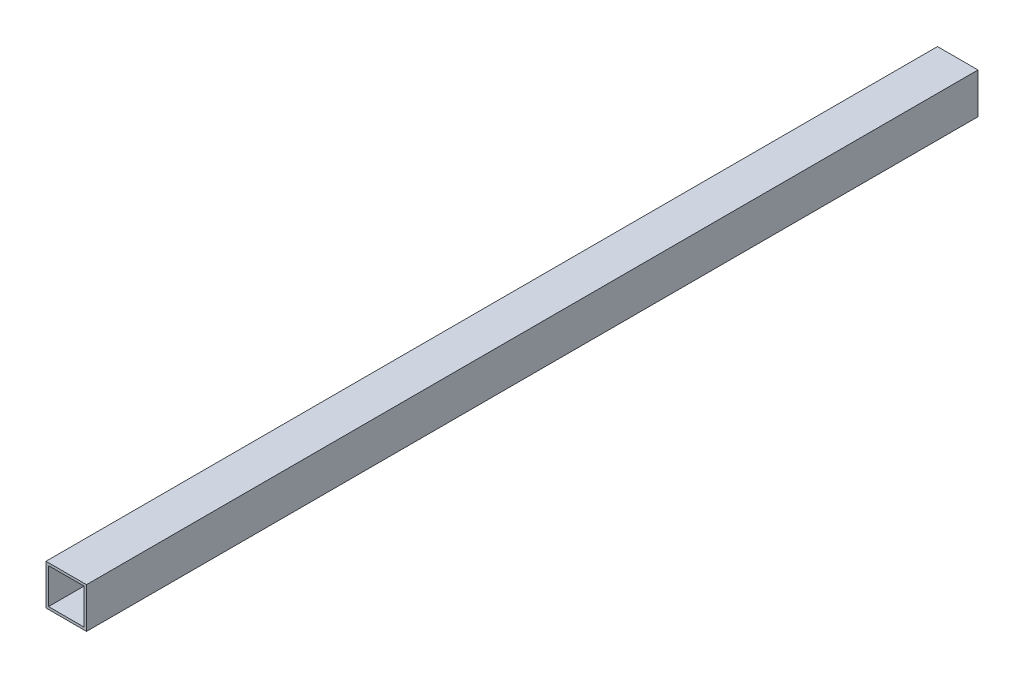
ISO-10303-21;
HEADER;
FILE_DESCRIPTION(('STEP AP214'),'2;1');
FILE_NAME('part.step','',(''),(''),'','','');
FILE_SCHEMA(('AUTOMOTIVE_DESIGN { 1 0 10303 214 1 1 1 1 }'));
ENDSEC;
DATA;
#1=APPLICATION_CONTEXT('core data for automotive mechanical design processes');
#2=APPLICATION_PROTOCOL_DEFINITION('international standard','automotive_design',2000,#1);
#3=PRODUCT_CONTEXT('',#1,'mechanical');
#4=PRODUCT('Part','Part','',(#3));
#5=PRODUCT_RELATED_PRODUCT_CATEGORY('part','',(#4));
#6=PRODUCT_DEFINITION_FORMATION('','',#4);
#7=PRODUCT_DEFINITION_CONTEXT('part definition',#1,'design');
#8=PRODUCT_DEFINITION('design','',#6,#7);
#9=PRODUCT_DEFINITION_SHAPE('','',#8);
#10=(LENGTH_UNIT() NAMED_UNIT(*) SI_UNIT(.MILLI.,.METRE.));
#11=(NAMED_UNIT(*) PLANE_ANGLE_UNIT() SI_UNIT($,.RADIAN.));
#12=(NAMED_UNIT(*) SI_UNIT($,.STERADIAN.) SOLID_ANGLE_UNIT());
#13=UNCERTAINTY_MEASURE_WITH_UNIT(LENGTH_MEASURE(1.E-05),#10,'distance_accuracy_value','');
#14=(GEOMETRIC_REPRESENTATION_CONTEXT(3) GLOBAL_UNCERTAINTY_ASSIGNED_CONTEXT((#13)) GLOBAL_UNIT_ASSIGNED_CONTEXT((#10,
#11,#12)) REPRESENTATION_CONTEXT('',''));
#15=CARTESIAN_POINT('',(0.,0.,0.));
#16=DIRECTION('',(0.,0.,1.));
#17=DIRECTION('',(1.,0.,0.));
#18=AXIS2_PLACEMENT_3D('',#15,#16,#17);
#19=CARTESIAN_POINT('',(12.7,-12.7,914.4));
#20=DIRECTION('',(-1.,0.,0.));
#21=DIRECTION('',(0.,0.,1.));
#22=AXIS2_PLACEMENT_3D('',#19,#20,#21);
#23=PLANE('',#22);
#24=DIRECTION('',(0.,0.,-1.));
#25=VECTOR('',#24,1.);
#26=CARTESIAN_POINT('',(12.7,12.7,914.4));
#27=LINE('',#26,#25);
#28=CARTESIAN_POINT('',(12.7,12.7,-355.6));
#29=VERTEX_POINT('',#28);
#30=CARTESIAN_POINT('',(12.7,12.7,-914.4));
#31=VERTEX_POINT('',#30);
#32=EDGE_CURVE('E47',#29,#31,#27,.T.);
#33=ORIENTED_EDGE('',*,*,#32,.F.);
#34=DIRECTION('',(0.,-1.,0.));
#35=VECTOR('',#34,1.);
#36=CARTESIAN_POINT('',(12.7,-12.7,-355.6));
#37=LINE('',#36,#35);
#38=CARTESIAN_POINT('',(12.7,-12.7,-355.6));
#39=VERTEX_POINT('',#38);
#40=EDGE_CURVE('E186',#29,#39,#37,.T.);
#41=ORIENTED_EDGE('',*,*,#40,.T.);
#42=DIRECTION('',(0.,0.,-1.));
#43=VECTOR('',#42,1.);
#44=CARTESIAN_POINT('',(12.7,-12.7,914.4));
#45=LINE('',#44,#43);
#46=CARTESIAN_POINT('',(12.7,-12.7,-914.4));
#47=VERTEX_POINT('',#46);
#48=EDGE_CURVE('E134',#39,#47,#45,.T.);
#49=ORIENTED_EDGE('',*,*,#48,.T.);
#50=DIRECTION('',(0.,1.,0.));
#51=VECTOR('',#50,1.);
#52=CARTESIAN_POINT('',(12.7,-12.7,-914.4));
#53=LINE('',#52,#51);
#54=EDGE_CURVE('E160',#47,#31,#53,.T.);
#55=ORIENTED_EDGE('',*,*,#54,.T.);
#56=EDGE_LOOP('',(#33,#41,#49,#55));
#57=FACE_BOUND('',#56,.T.);
#58=ADVANCED_FACE('F39',(#57),#23,.F.);
#59=CARTESIAN_POINT('',(-12.7,12.7,914.4));
#60=DIRECTION('',(0.,-1.,0.));
#61=DIRECTION('',(0.,0.,-1.));
#62=AXIS2_PLACEMENT_3D('',#59,#60,#61);
#63=PLANE('',#62);
#64=DIRECTION('',(0.,0.,-1.));
#65=VECTOR('',#64,1.);
#66=CARTESIAN_POINT('',(-12.7,12.7,914.4));
#67=LINE('',#66,#65);
#68=CARTESIAN_POINT('',(-12.7,12.7,-355.6));
#69=VERTEX_POINT('',#68);
#70=CARTESIAN_POINT('',(-12.7,12.7,-914.4));
#71=VERTEX_POINT('',#70);
#72=EDGE_CURVE('E140',#69,#71,#67,.T.);
#73=ORIENTED_EDGE('',*,*,#72,.F.);
#74=DIRECTION('',(1.,0.,0.));
#75=VECTOR('',#74,1.);
#76=CARTESIAN_POINT('',(-12.7,12.7,-355.6));
#77=LINE('',#76,#75);
#78=EDGE_CURVE('E151',#69,#29,#77,.T.);
#79=ORIENTED_EDGE('',*,*,#78,.T.);
#80=ORIENTED_EDGE('',*,*,#32,.T.);
#81=DIRECTION('',(-1.,0.,0.));
#82=VECTOR('',#81,1.);
#83=CARTESIAN_POINT('',(-12.7,12.7,-914.4));
#84=LINE('',#83,#82);
#85=EDGE_CURVE('E150',#31,#71,#84,.T.);
#86=ORIENTED_EDGE('',*,*,#85,.T.);
#87=EDGE_LOOP('',(#73,#79,#80,#86));
#88=FACE_BOUND('',#87,.T.);
#89=ADVANCED_FACE('F149',(#88),#63,.F.);
#90=CARTESIAN_POINT('',(-12.7,-12.7,914.4));
#91=DIRECTION('',(1.,0.,0.));
#92=DIRECTION('',(0.,0.,-1.));
#93=AXIS2_PLACEMENT_3D('',#90,#91,#92);
#94=PLANE('',#93);
#95=DIRECTION('',(0.,0.,-1.));
#96=VECTOR('',#95,1.);
#97=CARTESIAN_POINT('',(-12.7,-12.7,914.4));
#98=LINE('',#97,#96);
#99=CARTESIAN_POINT('',(-12.7,-12.7,-355.599999999999));
#100=VERTEX_POINT('',#99);
#101=CARTESIAN_POINT('',(-12.7,-12.7,-914.4));
#102=VERTEX_POINT('',#101);
#103=EDGE_CURVE('E137',#100,#102,#98,.T.);
#104=ORIENTED_EDGE('',*,*,#103,.F.);
#105=DIRECTION('',(0.,1.,0.));
#106=VECTOR('',#105,1.);
#107=CARTESIAN_POINT('',(-12.7,-12.7,-355.6));
#108=LINE('',#107,#106);
#109=EDGE_CURVE('E54',#100,#69,#108,.T.);
#110=ORIENTED_EDGE('',*,*,#109,.T.);
#111=ORIENTED_EDGE('',*,*,#72,.T.);
#112=DIRECTION('',(0.,-1.,0.));
#113=VECTOR('',#112,1.);
#114=CARTESIAN_POINT('',(-12.7,-12.7,-914.4));
#115=LINE('',#114,#113);
#116=EDGE_CURVE('E163',#71,#102,#115,.T.);
#117=ORIENTED_EDGE('',*,*,#116,.T.);
#118=EDGE_LOOP('',(#104,#110,#111,#117));
#119=FACE_BOUND('',#118,.T.);
#120=ADVANCED_FACE('F181',(#119),#94,.F.);
#121=CARTESIAN_POINT('',(-12.7,-12.7,914.4));
#122=DIRECTION('',(0.,1.,0.));
#123=DIRECTION('',(0.,0.,1.));
#124=AXIS2_PLACEMENT_3D('',#121,#122,#123);
#125=PLANE('',#124);
#126=ORIENTED_EDGE('',*,*,#48,.F.);
#127=DIRECTION('',(-1.,0.,0.));
#128=VECTOR('',#127,1.);
#129=CARTESIAN_POINT('',(-12.7,-12.7,-355.6));
#130=LINE('',#129,#128);
#131=EDGE_CURVE('E179',#39,#100,#130,.T.);
#132=ORIENTED_EDGE('',*,*,#131,.T.);
#133=ORIENTED_EDGE('',*,*,#103,.T.);
#134=DIRECTION('',(1.,0.,0.));
#135=VECTOR('',#134,1.);
#136=CARTESIAN_POINT('',(-12.7,-12.7,-914.4));
#137=LINE('',#136,#135);
#138=EDGE_CURVE('E128',#102,#47,#137,.T.);
#139=ORIENTED_EDGE('',*,*,#138,.T.);
#140=EDGE_LOOP('',(#126,#132,#133,#139));
#141=FACE_BOUND('',#140,.T.);
#142=ADVANCED_FACE('F177',(#141),#125,.F.);
#143=CARTESIAN_POINT('',(11.1125,-11.1125,914.4));
#144=DIRECTION('',(-1.,0.,0.));
#145=DIRECTION('',(0.,0.,1.));
#146=AXIS2_PLACEMENT_3D('',#143,#144,#145);
#147=PLANE('',#146);
#148=DIRECTION('',(0.,-1.,0.));
#149=VECTOR('',#148,1.);
#150=CARTESIAN_POINT('',(11.1125,-11.1125,-355.6));
#151=LINE('',#150,#149);
#152=CARTESIAN_POINT('',(11.1125,11.1125,-355.6));
#153=VERTEX_POINT('',#152);
#154=CARTESIAN_POINT('',(11.1125,-11.1125,-355.599999999999));
#155=VERTEX_POINT('',#154);
#156=EDGE_CURVE('E61',#153,#155,#151,.T.);
#157=ORIENTED_EDGE('',*,*,#156,.F.);
#158=DIRECTION('',(0.,0.,-1.));
#159=VECTOR('',#158,1.);
#160=CARTESIAN_POINT('',(11.1125,11.1125,914.4));
#161=LINE('',#160,#159);
#162=CARTESIAN_POINT('',(11.1125,11.1125,-914.4));
#163=VERTEX_POINT('',#162);
#164=EDGE_CURVE('E126',#153,#163,#161,.T.);
#165=ORIENTED_EDGE('',*,*,#164,.T.);
#166=DIRECTION('',(0.,1.,0.));
#167=VECTOR('',#166,1.);
#168=CARTESIAN_POINT('',(11.1125,-11.1125,-914.4));
#169=LINE('',#168,#167);
#170=CARTESIAN_POINT('',(11.1125,-11.1125,-914.4));
#171=VERTEX_POINT('',#170);
#172=EDGE_CURVE('E193',#171,#163,#169,.T.);
#173=ORIENTED_EDGE('',*,*,#172,.F.);
#174=DIRECTION('',(0.,0.,-1.));
#175=VECTOR('',#174,1.);
#176=CARTESIAN_POINT('',(11.1125,-11.1125,914.4));
#177=LINE('',#176,#175);
#178=EDGE_CURVE('E122',#155,#171,#177,.T.);
#179=ORIENTED_EDGE('',*,*,#178,.F.);
#180=EDGE_LOOP('',(#157,#165,#173,#179));
#181=FACE_BOUND('',#180,.T.);
#182=ADVANCED_FACE('F211',(#181),#147,.T.);
#183=CARTESIAN_POINT('',(-11.1125,11.1125,914.4));
#184=DIRECTION('',(0.,-1.,0.));
#185=DIRECTION('',(0.,0.,-1.));
#186=AXIS2_PLACEMENT_3D('',#183,#184,#185);
#187=PLANE('',#186);
#188=DIRECTION('',(1.,0.,0.));
#189=VECTOR('',#188,1.);
#190=CARTESIAN_POINT('',(-11.1125,11.1125,-355.6));
#191=LINE('',#190,#189);
#192=CARTESIAN_POINT('',(-11.1125,11.1125,-355.6));
#193=VERTEX_POINT('',#192);
#194=EDGE_CURVE('E115',#193,#153,#191,.T.);
#195=ORIENTED_EDGE('',*,*,#194,.F.);
#196=DIRECTION('',(0.,0.,-1.));
#197=VECTOR('',#196,1.);
#198=CARTESIAN_POINT('',(-11.1125,11.1125,914.4));
#199=LINE('',#198,#197);
#200=CARTESIAN_POINT('',(-11.1125,11.1125,-914.4));
#201=VERTEX_POINT('',#200);
#202=EDGE_CURVE('E113',#193,#201,#199,.T.);
#203=ORIENTED_EDGE('',*,*,#202,.T.);
#204=DIRECTION('',(-1.,0.,0.));
#205=VECTOR('',#204,1.);
#206=CARTESIAN_POINT('',(-11.1125,11.1125,-914.4));
#207=LINE('',#206,#205);
#208=EDGE_CURVE('E197',#163,#201,#207,.T.);
#209=ORIENTED_EDGE('',*,*,#208,.F.);
#210=ORIENTED_EDGE('',*,*,#164,.F.);
#211=EDGE_LOOP('',(#195,#203,#209,#210));
#212=FACE_BOUND('',#211,.T.);
#213=ADVANCED_FACE('F206',(#212),#187,.T.);
#214=CARTESIAN_POINT('',(-11.1125,-11.1125,914.4));
#215=DIRECTION('',(1.,0.,0.));
#216=DIRECTION('',(0.,0.,-1.));
#217=AXIS2_PLACEMENT_3D('',#214,#215,#216);
#218=PLANE('',#217);
#219=DIRECTION('',(0.,1.,0.));
#220=VECTOR('',#219,1.);
#221=CARTESIAN_POINT('',(-11.1125,-11.1125,-355.6));
#222=LINE('',#221,#220);
#223=CARTESIAN_POINT('',(-11.1125,-11.1125,-355.6));
#224=VERTEX_POINT('',#223);
#225=EDGE_CURVE('E102',#224,#193,#222,.T.);
#226=ORIENTED_EDGE('',*,*,#225,.F.);
#227=DIRECTION('',(0.,0.,-1.));
#228=VECTOR('',#227,1.);
#229=CARTESIAN_POINT('',(-11.1125,-11.1125,914.4));
#230=LINE('',#229,#228);
#231=CARTESIAN_POINT('',(-11.1125,-11.1125,-914.4));
#232=VERTEX_POINT('',#231);
#233=EDGE_CURVE('E111',#224,#232,#230,.T.);
#234=ORIENTED_EDGE('',*,*,#233,.T.);
#235=DIRECTION('',(0.,-1.,0.));
#236=VECTOR('',#235,1.);
#237=CARTESIAN_POINT('',(-11.1125,-11.1125,-914.4));
#238=LINE('',#237,#236);
#239=EDGE_CURVE('E170',#201,#232,#238,.T.);
#240=ORIENTED_EDGE('',*,*,#239,.F.);
#241=ORIENTED_EDGE('',*,*,#202,.F.);
#242=EDGE_LOOP('',(#226,#234,#240,#241));
#243=FACE_BOUND('',#242,.T.);
#244=ADVANCED_FACE('F109',(#243),#218,.T.);
#245=CARTESIAN_POINT('',(-11.1125,-11.1125,914.4));
#246=DIRECTION('',(0.,1.,0.));
#247=DIRECTION('',(0.,0.,1.));
#248=AXIS2_PLACEMENT_3D('',#245,#246,#247);
#249=PLANE('',#248);
#250=DIRECTION('',(-1.,0.,0.));
#251=VECTOR('',#250,1.);
#252=CARTESIAN_POINT('',(-11.1125,-11.1125,-355.6));
#253=LINE('',#252,#251);
#254=EDGE_CURVE('E11',#155,#224,#253,.T.);
#255=ORIENTED_EDGE('',*,*,#254,.F.);
#256=ORIENTED_EDGE('',*,*,#178,.T.);
#257=DIRECTION('',(1.,0.,0.));
#258=VECTOR('',#257,1.);
#259=CARTESIAN_POINT('',(-11.1125,-11.1125,-914.4));
#260=LINE('',#259,#258);
#261=EDGE_CURVE('E119',#232,#171,#260,.T.);
#262=ORIENTED_EDGE('',*,*,#261,.F.);
#263=ORIENTED_EDGE('',*,*,#233,.F.);
#264=EDGE_LOOP('',(#255,#256,#262,#263));
#265=FACE_BOUND('',#264,.T.);
#266=ADVANCED_FACE('F117',(#265),#249,.T.);
#267=CARTESIAN_POINT('',(0.,0.,-914.4));
#268=DIRECTION('',(0.,0.,-1.));
#269=DIRECTION('',(-1.,0.,0.));
#270=AXIS2_PLACEMENT_3D('',#267,#268,#269);
#271=PLANE('',#270);
#272=ORIENTED_EDGE('',*,*,#172,.T.);
#273=ORIENTED_EDGE('',*,*,#208,.T.);
#274=ORIENTED_EDGE('',*,*,#239,.T.);
#275=ORIENTED_EDGE('',*,*,#261,.T.);
#276=EDGE_LOOP('',(#272,#273,#274,#275));
#277=FACE_BOUND('',#276,.T.);
#278=ORIENTED_EDGE('',*,*,#54,.F.);
#279=ORIENTED_EDGE('',*,*,#138,.F.);
#280=ORIENTED_EDGE('',*,*,#116,.F.);
#281=ORIENTED_EDGE('',*,*,#85,.F.);
#282=EDGE_LOOP('',(#278,#279,#280,#281));
#283=FACE_BOUND('',#282,.T.);
#284=ADVANCED_FACE('F158',(#277,#283),#271,.T.);
#285=CARTESIAN_POINT('',(0.,0.,-355.6));
#286=DIRECTION('',(0.,0.,-1.));
#287=DIRECTION('',(-1.,0.,0.));
#288=AXIS2_PLACEMENT_3D('',#285,#286,#287);
#289=PLANE('',#288);
#290=ORIENTED_EDGE('',*,*,#156,.T.);
#291=ORIENTED_EDGE('',*,*,#254,.T.);
#292=ORIENTED_EDGE('',*,*,#225,.T.);
#293=ORIENTED_EDGE('',*,*,#194,.T.);
#294=EDGE_LOOP('',(#290,#291,#292,#293));
#295=FACE_BOUND('',#294,.T.);
#296=ORIENTED_EDGE('',*,*,#78,.F.);
#297=ORIENTED_EDGE('',*,*,#109,.F.);
#298=ORIENTED_EDGE('',*,*,#131,.F.);
#299=ORIENTED_EDGE('',*,*,#40,.F.);
#300=EDGE_LOOP('',(#296,#297,#298,#299));
#301=FACE_BOUND('',#300,.T.);
#302=ADVANCED_FACE('F101',(#295,#301),#289,.F.);
#303=CLOSED_SHELL('',(#58,#89,#120,#142,#182,#213,#244,#266,#284,#302));
#304=MANIFOLD_SOLID_BREP('B2',#303);
#305=ADVANCED_BREP_SHAPE_REPRESENTATION('',(#18,#304),#14);
#306=SHAPE_DEFINITION_REPRESENTATION(#9,#305);
ENDSEC;
END-ISO-10303-21;
